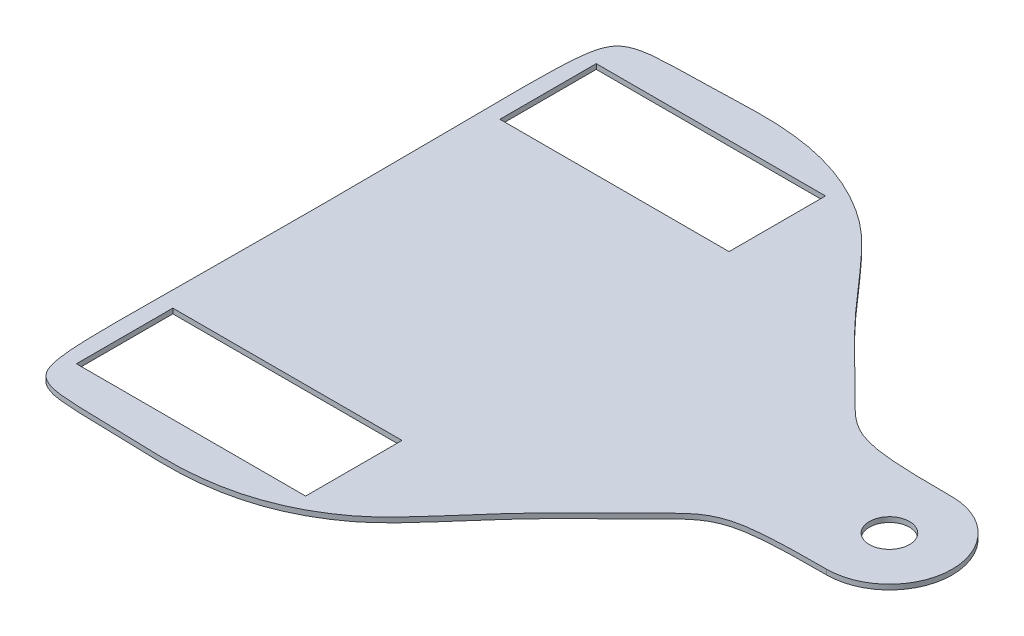
ISO-10303-21;
HEADER;
FILE_DESCRIPTION(('STEP AP214'),'2;1');
FILE_NAME('part.step','',(''),(''),'','','');
FILE_SCHEMA(('AUTOMOTIVE_DESIGN { 1 0 10303 214 1 1 1 1 }'));
ENDSEC;
DATA;
#1=APPLICATION_CONTEXT('core data for automotive mechanical design processes');
#2=APPLICATION_PROTOCOL_DEFINITION('international standard','automotive_design',2000,#1);
#3=PRODUCT_CONTEXT('',#1,'mechanical');
#4=PRODUCT('Part','Part','',(#3));
#5=PRODUCT_RELATED_PRODUCT_CATEGORY('part','',(#4));
#6=PRODUCT_DEFINITION_FORMATION('','',#4);
#7=PRODUCT_DEFINITION_CONTEXT('part definition',#1,'design');
#8=PRODUCT_DEFINITION('design','',#6,#7);
#9=PRODUCT_DEFINITION_SHAPE('','',#8);
#10=(LENGTH_UNIT() NAMED_UNIT(*) SI_UNIT(.MILLI.,.METRE.));
#11=(NAMED_UNIT(*) PLANE_ANGLE_UNIT() SI_UNIT($,.RADIAN.));
#12=(NAMED_UNIT(*) SI_UNIT($,.STERADIAN.) SOLID_ANGLE_UNIT());
#13=UNCERTAINTY_MEASURE_WITH_UNIT(LENGTH_MEASURE(1.E-05),#10,'distance_accuracy_value','');
#14=(GEOMETRIC_REPRESENTATION_CONTEXT(3) GLOBAL_UNCERTAINTY_ASSIGNED_CONTEXT((#13)) GLOBAL_UNIT_ASSIGNED_CONTEXT((#10,
#11,#12)) REPRESENTATION_CONTEXT('',''));
#15=CARTESIAN_POINT('',(0.,0.,0.));
#16=DIRECTION('',(0.,0.,1.));
#17=DIRECTION('',(1.,0.,0.));
#18=AXIS2_PLACEMENT_3D('',#15,#16,#17);
#19=CARTESIAN_POINT('',(0.,-1.2,15.));
#20=CARTESIAN_POINT('',(-26.0596661142578,-1.2,15.));
#21=CARTESIAN_POINT('',(-24.2984195046389,-1.2,16.8762062496136));
#22=CARTESIAN_POINT('',(-51.0085621302857,-1.2,41.9815243102457));
#23=CARTESIAN_POINT('',(-61.2895667684253,-1.2,55.9447354104585));
#24=CARTESIAN_POINT('',(-79.9531211554652,-1.2,69.6920830360387));
#25=CARTESIAN_POINT('',(-95.0157621605081,-1.2,71.7162556085096));
#26=CARTESIAN_POINT('',(-110.818983437193,-1.2,71.0052312531872));
#27=CARTESIAN_POINT('',(-126.521993889703,-1.2,70.8741001774513));
#28=CARTESIAN_POINT('',(-138.142838542993,-1.2,68.217935498934));
#29=CARTESIAN_POINT('',(-135.85,-1.2,61.1511041592246));
#30=CARTESIAN_POINT('',(-135.85,-1.2,0.));
#31=B_SPLINE_CURVE_WITH_KNOTS('',3,(#19,#20,#21,#22,#23,#24,#25,#26,#27,#28,#29,#30),
.UNSPECIFIED.,.F.,.F.,(4,1,1,1,1,1,1,1,1,4),(0.,0.141137684512468,0.170317060843302,
0.278296351923339,0.317035273345273,0.518967353640707,0.554462650934979,0.636492948993727,
0.682072062625964,1.),.UNSPECIFIED.);
#32=DIRECTION('',(0.,1.,0.));
#33=VECTOR('',#32,1.);
#34=SURFACE_OF_LINEAR_EXTRUSION('',#31,#33);
#35=CARTESIAN_POINT('',(0.,0.,15.));
#36=CARTESIAN_POINT('',(-26.0596661142578,0.,15.));
#37=CARTESIAN_POINT('',(-24.2984195046389,0.,16.8762062496136));
#38=CARTESIAN_POINT('',(-51.0085621302857,0.,41.9815243102457));
#39=CARTESIAN_POINT('',(-61.2895667684253,0.,55.9447354104585));
#40=CARTESIAN_POINT('',(-79.9531211554652,0.,69.6920830360387));
#41=CARTESIAN_POINT('',(-95.0157621605081,0.,71.7162556085096));
#42=CARTESIAN_POINT('',(-110.818983437193,0.,71.0052312531872));
#43=CARTESIAN_POINT('',(-126.521993889703,0.,70.8741001774513));
#44=CARTESIAN_POINT('',(-138.142838542993,0.,68.217935498934));
#45=CARTESIAN_POINT('',(-135.85,0.,61.1511041592246));
#46=CARTESIAN_POINT('',(-135.85,0.,0.));
#47=B_SPLINE_CURVE_WITH_KNOTS('',3,(#35,#36,#37,#38,#39,#40,#41,#42,#43,#44,#45,#46),
.UNSPECIFIED.,.F.,.F.,(4,1,1,1,1,1,1,1,1,4),(0.,0.141137684512468,0.170317060843302,
0.278296351923339,0.317035273345273,0.518967353640707,0.554462650934979,0.636492948993727,
0.682072062625964,1.),.UNSPECIFIED.);
#48=CARTESIAN_POINT('',(0.,0.,15.));
#49=VERTEX_POINT('',#48);
#50=CARTESIAN_POINT('',(-135.85,0.,0.));
#51=VERTEX_POINT('',#50);
#52=EDGE_CURVE('E165',#49,#51,#47,.T.);
#53=ORIENTED_EDGE('',*,*,#52,.T.);
#54=DIRECTION('',(0.,1.,0.));
#55=VECTOR('',#54,1.);
#56=CARTESIAN_POINT('',(-135.85,-1.2,0.));
#57=LINE('',#56,#55);
#58=CARTESIAN_POINT('',(-135.85,-1.2,0.));
#59=VERTEX_POINT('',#58);
#60=EDGE_CURVE('E11',#59,#51,#57,.T.);
#61=ORIENTED_EDGE('',*,*,#60,.F.);
#62=CARTESIAN_POINT('',(0.,-1.2,15.));
#63=VERTEX_POINT('',#62);
#64=EDGE_CURVE('E199',#63,#59,#31,.T.);
#65=ORIENTED_EDGE('',*,*,#64,.F.);
#66=DIRECTION('',(0.,1.,0.));
#67=VECTOR('',#66,1.);
#68=CARTESIAN_POINT('',(0.,-1.2,15.));
#69=LINE('',#68,#67);
#70=EDGE_CURVE('E46',#63,#49,#69,.T.);
#71=ORIENTED_EDGE('',*,*,#70,.T.);
#72=EDGE_LOOP('',(#53,#61,#65,#71));
#73=FACE_BOUND('',#72,.T.);
#74=ADVANCED_FACE('F42',(#73),#34,.F.);
#75=CARTESIAN_POINT('',(0.,-1.2,-15.));
#76=CARTESIAN_POINT('',(-26.0596661142578,-1.2,-15.));
#77=CARTESIAN_POINT('',(-24.2984195046389,-1.2,-16.8762062496136));
#78=CARTESIAN_POINT('',(-51.0085621302857,-1.2,-41.9815243102457));
#79=CARTESIAN_POINT('',(-61.2895667684253,-1.2,-55.9447354104585));
#80=CARTESIAN_POINT('',(-79.9531211554652,-1.2,-69.6920830360387));
#81=CARTESIAN_POINT('',(-95.0157621605081,-1.2,-71.7162556085096));
#82=CARTESIAN_POINT('',(-110.818983437193,-1.2,-71.0052312531872));
#83=CARTESIAN_POINT('',(-126.521993889703,-1.2,-70.8741001774513));
#84=CARTESIAN_POINT('',(-138.142838542993,-1.2,-68.217935498934));
#85=CARTESIAN_POINT('',(-135.85,-1.2,-61.1511041592246));
#86=CARTESIAN_POINT('',(-135.85,-1.2,0.));
#87=B_SPLINE_CURVE_WITH_KNOTS('',3,(#75,#76,#77,#78,#79,#80,#81,#82,#83,#84,#85,#86),
.UNSPECIFIED.,.F.,.F.,(4,1,1,1,1,1,1,1,1,4),(0.,0.141137684512468,0.170317060843302,
0.278296351923339,0.317035273345273,0.518967353640707,0.554462650934979,0.636492948993727,
0.682072062625964,1.),.UNSPECIFIED.);
#88=DIRECTION('',(0.,1.,0.));
#89=VECTOR('',#88,1.);
#90=SURFACE_OF_LINEAR_EXTRUSION('',#87,#89);
#91=CARTESIAN_POINT('',(0.,0.,-15.));
#92=CARTESIAN_POINT('',(-26.0596661142578,0.,-15.));
#93=CARTESIAN_POINT('',(-24.2984195046389,0.,-16.8762062496136));
#94=CARTESIAN_POINT('',(-51.0085621302857,0.,-41.9815243102457));
#95=CARTESIAN_POINT('',(-61.2895667684253,0.,-55.9447354104585));
#96=CARTESIAN_POINT('',(-79.9531211554652,0.,-69.6920830360387));
#97=CARTESIAN_POINT('',(-95.0157621605081,0.,-71.7162556085096));
#98=CARTESIAN_POINT('',(-110.818983437193,0.,-71.0052312531872));
#99=CARTESIAN_POINT('',(-126.521993889703,0.,-70.8741001774513));
#100=CARTESIAN_POINT('',(-138.142838542993,0.,-68.217935498934));
#101=CARTESIAN_POINT('',(-135.85,0.,-61.1511041592246));
#102=CARTESIAN_POINT('',(-135.85,0.,0.));
#103=B_SPLINE_CURVE_WITH_KNOTS('',3,(#91,#92,#93,#94,#95,#96,#97,#98,#99,#100,#101,#102),
.UNSPECIFIED.,.F.,.F.,(4,1,1,1,1,1,1,1,1,4),(0.,0.141137684512468,0.170317060843302,
0.278296351923339,0.317035273345273,0.518967353640707,0.554462650934979,0.636492948993727,
0.682072062625964,1.),.UNSPECIFIED.);
#104=CARTESIAN_POINT('',(0.,0.,-15.));
#105=VERTEX_POINT('',#104);
#106=EDGE_CURVE('E205',#105,#51,#103,.T.);
#107=ORIENTED_EDGE('',*,*,#106,.F.);
#108=DIRECTION('',(0.,1.,0.));
#109=VECTOR('',#108,1.);
#110=CARTESIAN_POINT('',(0.,-1.2,-15.));
#111=LINE('',#110,#109);
#112=CARTESIAN_POINT('',(0.,-1.2,-15.));
#113=VERTEX_POINT('',#112);
#114=EDGE_CURVE('E51',#113,#105,#111,.T.);
#115=ORIENTED_EDGE('',*,*,#114,.F.);
#116=EDGE_CURVE('E211',#113,#59,#87,.T.);
#117=ORIENTED_EDGE('',*,*,#116,.T.);
#118=ORIENTED_EDGE('',*,*,#60,.T.);
#119=EDGE_LOOP('',(#107,#115,#117,#118));
#120=FACE_BOUND('',#119,.T.);
#121=ADVANCED_FACE('F224',(#120),#90,.T.);
#122=CARTESIAN_POINT('',(0.,-1.2,0.));
#123=DIRECTION('',(0.,1.,0.));
#124=DIRECTION('',(0.,0.,1.));
#125=AXIS2_PLACEMENT_3D('',#122,#123,#124);
#126=CYLINDRICAL_SURFACE('',#125,15.);
#127=CARTESIAN_POINT('',(0.,0.,0.));
#128=DIRECTION('',(0.,1.,0.));
#129=DIRECTION('',(0.,0.,1.));
#130=AXIS2_PLACEMENT_3D('',#127,#128,#129);
#131=CIRCLE('',#130,15.);
#132=EDGE_CURVE('E249',#49,#105,#131,.T.);
#133=ORIENTED_EDGE('',*,*,#132,.F.);
#134=ORIENTED_EDGE('',*,*,#70,.F.);
#135=CARTESIAN_POINT('',(0.,-1.2,0.));
#136=DIRECTION('',(0.,1.,0.));
#137=DIRECTION('',(0.,0.,1.));
#138=AXIS2_PLACEMENT_3D('',#135,#136,#137);
#139=CIRCLE('',#138,15.);
#140=EDGE_CURVE('E204',#63,#113,#139,.T.);
#141=ORIENTED_EDGE('',*,*,#140,.T.);
#142=ORIENTED_EDGE('',*,*,#114,.T.);
#143=EDGE_LOOP('',(#133,#134,#141,#142));
#144=FACE_BOUND('',#143,.T.);
#145=ADVANCED_FACE('F227',(#144),#126,.T.);
#146=CARTESIAN_POINT('',(0.,-1.2,0.));
#147=DIRECTION('',(0.,1.,0.));
#148=DIRECTION('',(0.,0.,1.));
#149=AXIS2_PLACEMENT_3D('',#146,#147,#148);
#150=PLANE('',#149);
#151=CARTESIAN_POINT('',(0.,-1.2,0.));
#152=DIRECTION('',(0.,1.,0.));
#153=DIRECTION('',(0.,0.,1.));
#154=AXIS2_PLACEMENT_3D('',#151,#152,#153);
#155=CIRCLE('',#154,4.7879);
#156=CARTESIAN_POINT('',(0.,-1.2,4.7879));
#157=VERTEX_POINT('',#156);
#158=EDGE_CURVE('E178',#157,#157,#155,.T.);
#159=ORIENTED_EDGE('',*,*,#158,.T.);
#160=EDGE_LOOP('',(#159));
#161=FACE_BOUND('',#160,.T.);
#162=DIRECTION('',(-1.,0.,0.));
#163=VECTOR('',#162,1.);
#164=CARTESIAN_POINT('',(-77.4500000000001,-1.2,-39.1));
#165=LINE('',#164,#163);
#166=CARTESIAN_POINT('',(-77.4500000000001,-1.2,-39.1));
#167=VERTEX_POINT('',#166);
#168=CARTESIAN_POINT('',(-132.25,-1.2,-39.1));
#169=VERTEX_POINT('',#168);
#170=EDGE_CURVE('E159',#167,#169,#165,.T.);
#171=ORIENTED_EDGE('',*,*,#170,.F.);
#172=DIRECTION('',(0.,0.,1.));
#173=VECTOR('',#172,1.);
#174=CARTESIAN_POINT('',(-77.4500000000001,-1.2,-62.15));
#175=LINE('',#174,#173);
#176=CARTESIAN_POINT('',(-77.4500000000001,-1.2,-62.15));
#177=VERTEX_POINT('',#176);
#178=EDGE_CURVE('E59',#177,#167,#175,.T.);
#179=ORIENTED_EDGE('',*,*,#178,.F.);
#180=DIRECTION('',(1.,0.,0.));
#181=VECTOR('',#180,1.);
#182=CARTESIAN_POINT('',(-132.25,-1.2,-62.15));
#183=LINE('',#182,#181);
#184=CARTESIAN_POINT('',(-132.25,-1.2,-62.15));
#185=VERTEX_POINT('',#184);
#186=EDGE_CURVE('E147',#185,#177,#183,.T.);
#187=ORIENTED_EDGE('',*,*,#186,.F.);
#188=DIRECTION('',(0.,0.,-1.));
#189=VECTOR('',#188,1.);
#190=CARTESIAN_POINT('',(-132.25,-1.2,-39.1));
#191=LINE('',#190,#189);
#192=EDGE_CURVE('E150',#169,#185,#191,.T.);
#193=ORIENTED_EDGE('',*,*,#192,.F.);
#194=EDGE_LOOP('',(#171,#179,#187,#193));
#195=FACE_BOUND('',#194,.T.);
#196=DIRECTION('',(0.,0.,1.));
#197=VECTOR('',#196,1.);
#198=CARTESIAN_POINT('',(-77.4500000000001,-1.2,39.1));
#199=LINE('',#198,#197);
#200=CARTESIAN_POINT('',(-77.4500000000001,-1.2,39.1));
#201=VERTEX_POINT('',#200);
#202=CARTESIAN_POINT('',(-77.4500000000001,-1.2,62.15));
#203=VERTEX_POINT('',#202);
#204=EDGE_CURVE('E186',#201,#203,#199,.T.);
#205=ORIENTED_EDGE('',*,*,#204,.F.);
#206=DIRECTION('',(1.,0.,0.));
#207=VECTOR('',#206,1.);
#208=CARTESIAN_POINT('',(-132.25,-1.2,39.1));
#209=LINE('',#208,#207);
#210=CARTESIAN_POINT('',(-132.25,-1.2,39.1));
#211=VERTEX_POINT('',#210);
#212=EDGE_CURVE('E67',#211,#201,#209,.T.);
#213=ORIENTED_EDGE('',*,*,#212,.F.);
#214=DIRECTION('',(0.,0.,-1.));
#215=VECTOR('',#214,1.);
#216=CARTESIAN_POINT('',(-132.25,-1.2,62.15));
#217=LINE('',#216,#215);
#218=CARTESIAN_POINT('',(-132.25,-1.2,62.15));
#219=VERTEX_POINT('',#218);
#220=EDGE_CURVE('E179',#219,#211,#217,.T.);
#221=ORIENTED_EDGE('',*,*,#220,.F.);
#222=DIRECTION('',(-1.,0.,0.));
#223=VECTOR('',#222,1.);
#224=CARTESIAN_POINT('',(-77.4500000000001,-1.2,62.15));
#225=LINE('',#224,#223);
#226=EDGE_CURVE('E182',#203,#219,#225,.T.);
#227=ORIENTED_EDGE('',*,*,#226,.F.);
#228=EDGE_LOOP('',(#205,#213,#221,#227));
#229=FACE_BOUND('',#228,.T.);
#230=ORIENTED_EDGE('',*,*,#64,.T.);
#231=ORIENTED_EDGE('',*,*,#116,.F.);
#232=ORIENTED_EDGE('',*,*,#140,.F.);
#233=EDGE_LOOP('',(#230,#231,#232));
#234=FACE_BOUND('',#233,.T.);
#235=ADVANCED_FACE('F231',(#161,#195,#229,#234),#150,.F.);
#236=CARTESIAN_POINT('',(0.,0.,0.));
#237=DIRECTION('',(0.,1.,0.));
#238=DIRECTION('',(0.,0.,1.));
#239=AXIS2_PLACEMENT_3D('',#236,#237,#238);
#240=PLANE('',#239);
#241=CARTESIAN_POINT('',(0.,0.,0.));
#242=DIRECTION('',(0.,1.,0.));
#243=DIRECTION('',(0.,0.,1.));
#244=AXIS2_PLACEMENT_3D('',#241,#242,#243);
#245=CIRCLE('',#244,4.7879);
#246=CARTESIAN_POINT('',(0.,0.,4.7879));
#247=VERTEX_POINT('',#246);
#248=EDGE_CURVE('E153',#247,#247,#245,.T.);
#249=ORIENTED_EDGE('',*,*,#248,.F.);
#250=EDGE_LOOP('',(#249));
#251=FACE_BOUND('',#250,.T.);
#252=DIRECTION('',(0.,0.,1.));
#253=VECTOR('',#252,1.);
#254=CARTESIAN_POINT('',(-77.4500000000001,0.,-62.15));
#255=LINE('',#254,#253);
#256=CARTESIAN_POINT('',(-77.4500000000001,0.,-62.15));
#257=VERTEX_POINT('',#256);
#258=CARTESIAN_POINT('',(-77.4500000000001,0.,-39.1));
#259=VERTEX_POINT('',#258);
#260=EDGE_CURVE('E128',#257,#259,#255,.T.);
#261=ORIENTED_EDGE('',*,*,#260,.T.);
#262=DIRECTION('',(-1.,0.,0.));
#263=VECTOR('',#262,1.);
#264=CARTESIAN_POINT('',(-77.4500000000001,0.,-39.1));
#265=LINE('',#264,#263);
#266=CARTESIAN_POINT('',(-132.25,0.,-39.1));
#267=VERTEX_POINT('',#266);
#268=EDGE_CURVE('E138',#259,#267,#265,.T.);
#269=ORIENTED_EDGE('',*,*,#268,.T.);
#270=DIRECTION('',(0.,0.,-1.));
#271=VECTOR('',#270,1.);
#272=CARTESIAN_POINT('',(-132.25,0.,-39.1));
#273=LINE('',#272,#271);
#274=CARTESIAN_POINT('',(-132.25,0.,-62.15));
#275=VERTEX_POINT('',#274);
#276=EDGE_CURVE('E142',#267,#275,#273,.T.);
#277=ORIENTED_EDGE('',*,*,#276,.T.);
#278=DIRECTION('',(1.,0.,0.));
#279=VECTOR('',#278,1.);
#280=CARTESIAN_POINT('',(-132.25,0.,-62.15));
#281=LINE('',#280,#279);
#282=EDGE_CURVE('E134',#275,#257,#281,.T.);
#283=ORIENTED_EDGE('',*,*,#282,.T.);
#284=EDGE_LOOP('',(#261,#269,#277,#283));
#285=FACE_BOUND('',#284,.T.);
#286=DIRECTION('',(1.,0.,0.));
#287=VECTOR('',#286,1.);
#288=CARTESIAN_POINT('',(-132.25,0.,39.1));
#289=LINE('',#288,#287);
#290=CARTESIAN_POINT('',(-132.25,0.,39.1));
#291=VERTEX_POINT('',#290);
#292=CARTESIAN_POINT('',(-77.4500000000001,0.,39.1));
#293=VERTEX_POINT('',#292);
#294=EDGE_CURVE('E183',#291,#293,#289,.T.);
#295=ORIENTED_EDGE('',*,*,#294,.T.);
#296=DIRECTION('',(0.,0.,1.));
#297=VECTOR('',#296,1.);
#298=CARTESIAN_POINT('',(-77.4500000000001,0.,39.1));
#299=LINE('',#298,#297);
#300=CARTESIAN_POINT('',(-77.4500000000001,0.,62.15));
#301=VERTEX_POINT('',#300);
#302=EDGE_CURVE('E195',#293,#301,#299,.T.);
#303=ORIENTED_EDGE('',*,*,#302,.T.);
#304=DIRECTION('',(-1.,0.,0.));
#305=VECTOR('',#304,1.);
#306=CARTESIAN_POINT('',(-77.4500000000001,0.,62.15));
#307=LINE('',#306,#305);
#308=CARTESIAN_POINT('',(-132.25,0.,62.15));
#309=VERTEX_POINT('',#308);
#310=EDGE_CURVE('E192',#301,#309,#307,.T.);
#311=ORIENTED_EDGE('',*,*,#310,.T.);
#312=DIRECTION('',(0.,0.,-1.));
#313=VECTOR('',#312,1.);
#314=CARTESIAN_POINT('',(-132.25,0.,62.15));
#315=LINE('',#314,#313);
#316=EDGE_CURVE('E171',#309,#291,#315,.T.);
#317=ORIENTED_EDGE('',*,*,#316,.T.);
#318=EDGE_LOOP('',(#295,#303,#311,#317));
#319=FACE_BOUND('',#318,.T.);
#320=ORIENTED_EDGE('',*,*,#52,.F.);
#321=ORIENTED_EDGE('',*,*,#132,.T.);
#322=ORIENTED_EDGE('',*,*,#106,.T.);
#323=EDGE_LOOP('',(#320,#321,#322));
#324=FACE_BOUND('',#323,.T.);
#325=ADVANCED_FACE('F144',(#251,#285,#319,#324),#240,.T.);
#326=CARTESIAN_POINT('',(-132.25,0.,39.1));
#327=DIRECTION('',(0.,0.,-1.));
#328=DIRECTION('',(-1.,0.,0.));
#329=AXIS2_PLACEMENT_3D('',#326,#327,#328);
#330=PLANE('',#329);
#331=ORIENTED_EDGE('',*,*,#212,.T.);
#332=DIRECTION('',(0.,-1.,0.));
#333=VECTOR('',#332,1.);
#334=CARTESIAN_POINT('',(-77.4500000000001,0.,39.1));
#335=LINE('',#334,#333);
#336=EDGE_CURVE('E169',#293,#201,#335,.T.);
#337=ORIENTED_EDGE('',*,*,#336,.F.);
#338=ORIENTED_EDGE('',*,*,#294,.F.);
#339=DIRECTION('',(0.,-1.,0.));
#340=VECTOR('',#339,1.);
#341=CARTESIAN_POINT('',(-132.25,0.,39.1));
#342=LINE('',#341,#340);
#343=EDGE_CURVE('E176',#291,#211,#342,.T.);
#344=ORIENTED_EDGE('',*,*,#343,.T.);
#345=EDGE_LOOP('',(#331,#337,#338,#344));
#346=FACE_BOUND('',#345,.T.);
#347=ADVANCED_FACE('F261',(#346),#330,.F.);
#348=CARTESIAN_POINT('',(-132.25,0.,62.15));
#349=DIRECTION('',(-1.,0.,0.));
#350=DIRECTION('',(0.,0.,1.));
#351=AXIS2_PLACEMENT_3D('',#348,#349,#350);
#352=PLANE('',#351);
#353=ORIENTED_EDGE('',*,*,#220,.T.);
#354=ORIENTED_EDGE('',*,*,#343,.F.);
#355=ORIENTED_EDGE('',*,*,#316,.F.);
#356=DIRECTION('',(0.,-1.,0.));
#357=VECTOR('',#356,1.);
#358=CARTESIAN_POINT('',(-132.25,0.,62.15));
#359=LINE('',#358,#357);
#360=EDGE_CURVE('E174',#309,#219,#359,.T.);
#361=ORIENTED_EDGE('',*,*,#360,.T.);
#362=EDGE_LOOP('',(#353,#354,#355,#361));
#363=FACE_BOUND('',#362,.T.);
#364=ADVANCED_FACE('F266',(#363),#352,.F.);
#365=CARTESIAN_POINT('',(-77.4500000000001,0.,62.15));
#366=DIRECTION('',(0.,0.,1.));
#367=DIRECTION('',(1.,0.,0.));
#368=AXIS2_PLACEMENT_3D('',#365,#366,#367);
#369=PLANE('',#368);
#370=ORIENTED_EDGE('',*,*,#226,.T.);
#371=ORIENTED_EDGE('',*,*,#360,.F.);
#372=ORIENTED_EDGE('',*,*,#310,.F.);
#373=DIRECTION('',(0.,-1.,0.));
#374=VECTOR('',#373,1.);
#375=CARTESIAN_POINT('',(-77.4500000000001,0.,62.15));
#376=LINE('',#375,#374);
#377=EDGE_CURVE('E172',#301,#203,#376,.T.);
#378=ORIENTED_EDGE('',*,*,#377,.T.);
#379=EDGE_LOOP('',(#370,#371,#372,#378));
#380=FACE_BOUND('',#379,.T.);
#381=ADVANCED_FACE('F296',(#380),#369,.F.);
#382=CARTESIAN_POINT('',(-77.4500000000001,0.,39.1));
#383=DIRECTION('',(1.,0.,0.));
#384=DIRECTION('',(0.,0.,-1.));
#385=AXIS2_PLACEMENT_3D('',#382,#383,#384);
#386=PLANE('',#385);
#387=ORIENTED_EDGE('',*,*,#204,.T.);
#388=ORIENTED_EDGE('',*,*,#377,.F.);
#389=ORIENTED_EDGE('',*,*,#302,.F.);
#390=ORIENTED_EDGE('',*,*,#336,.T.);
#391=EDGE_LOOP('',(#387,#388,#389,#390));
#392=FACE_BOUND('',#391,.T.);
#393=ADVANCED_FACE('F292',(#392),#386,.F.);
#394=CARTESIAN_POINT('',(-77.4500000000001,0.,-62.15));
#395=DIRECTION('',(1.,0.,0.));
#396=DIRECTION('',(0.,0.,-1.));
#397=AXIS2_PLACEMENT_3D('',#394,#395,#396);
#398=PLANE('',#397);
#399=ORIENTED_EDGE('',*,*,#178,.T.);
#400=DIRECTION('',(0.,-1.,0.));
#401=VECTOR('',#400,1.);
#402=CARTESIAN_POINT('',(-77.4500000000001,0.,-39.1));
#403=LINE('',#402,#401);
#404=EDGE_CURVE('E124',#259,#167,#403,.T.);
#405=ORIENTED_EDGE('',*,*,#404,.F.);
#406=ORIENTED_EDGE('',*,*,#260,.F.);
#407=DIRECTION('',(0.,-1.,0.));
#408=VECTOR('',#407,1.);
#409=CARTESIAN_POINT('',(-77.4500000000001,0.,-62.15));
#410=LINE('',#409,#408);
#411=EDGE_CURVE('E163',#257,#177,#410,.T.);
#412=ORIENTED_EDGE('',*,*,#411,.T.);
#413=EDGE_LOOP('',(#399,#405,#406,#412));
#414=FACE_BOUND('',#413,.T.);
#415=ADVANCED_FACE('F126',(#414),#398,.F.);
#416=CARTESIAN_POINT('',(-132.25,0.,-62.15));
#417=DIRECTION('',(0.,0.,-1.));
#418=DIRECTION('',(-1.,0.,0.));
#419=AXIS2_PLACEMENT_3D('',#416,#417,#418);
#420=PLANE('',#419);
#421=ORIENTED_EDGE('',*,*,#186,.T.);
#422=ORIENTED_EDGE('',*,*,#411,.F.);
#423=ORIENTED_EDGE('',*,*,#282,.F.);
#424=DIRECTION('',(0.,-1.,0.));
#425=VECTOR('',#424,1.);
#426=CARTESIAN_POINT('',(-132.25,0.,-62.15));
#427=LINE('',#426,#425);
#428=EDGE_CURVE('E166',#275,#185,#427,.T.);
#429=ORIENTED_EDGE('',*,*,#428,.T.);
#430=EDGE_LOOP('',(#421,#422,#423,#429));
#431=FACE_BOUND('',#430,.T.);
#432=ADVANCED_FACE('F284',(#431),#420,.F.);
#433=CARTESIAN_POINT('',(-132.25,0.,-39.1));
#434=DIRECTION('',(-1.,0.,0.));
#435=DIRECTION('',(0.,0.,1.));
#436=AXIS2_PLACEMENT_3D('',#433,#434,#435);
#437=PLANE('',#436);
#438=ORIENTED_EDGE('',*,*,#192,.T.);
#439=ORIENTED_EDGE('',*,*,#428,.F.);
#440=ORIENTED_EDGE('',*,*,#276,.F.);
#441=DIRECTION('',(0.,-1.,0.));
#442=VECTOR('',#441,1.);
#443=CARTESIAN_POINT('',(-132.25,0.,-39.1));
#444=LINE('',#443,#442);
#445=EDGE_CURVE('E133',#267,#169,#444,.T.);
#446=ORIENTED_EDGE('',*,*,#445,.T.);
#447=EDGE_LOOP('',(#438,#439,#440,#446));
#448=FACE_BOUND('',#447,.T.);
#449=ADVANCED_FACE('F281',(#448),#437,.F.);
#450=CARTESIAN_POINT('',(-77.4500000000001,0.,-39.1));
#451=DIRECTION('',(0.,0.,1.));
#452=DIRECTION('',(1.,0.,0.));
#453=AXIS2_PLACEMENT_3D('',#450,#451,#452);
#454=PLANE('',#453);
#455=ORIENTED_EDGE('',*,*,#170,.T.);
#456=ORIENTED_EDGE('',*,*,#445,.F.);
#457=ORIENTED_EDGE('',*,*,#268,.F.);
#458=ORIENTED_EDGE('',*,*,#404,.T.);
#459=EDGE_LOOP('',(#455,#456,#457,#458));
#460=FACE_BOUND('',#459,.T.);
#461=ADVANCED_FACE('F139',(#460),#454,.F.);
#462=CARTESIAN_POINT('',(0.,-1.2,0.));
#463=DIRECTION('',(0.,1.,0.));
#464=DIRECTION('',(0.,0.,1.));
#465=AXIS2_PLACEMENT_3D('',#462,#463,#464);
#466=CYLINDRICAL_SURFACE('',#465,4.7879);
#467=ORIENTED_EDGE('',*,*,#158,.F.);
#468=EDGE_LOOP('',(#467));
#469=FACE_BOUND('',#468,.T.);
#470=ORIENTED_EDGE('',*,*,#248,.T.);
#471=EDGE_LOOP('',(#470));
#472=FACE_BOUND('',#471,.T.);
#473=ADVANCED_FACE('F275',(#469,#472),#466,.F.);
#474=CLOSED_SHELL('',(#74,#121,#145,#235,#325,#347,#364,#381,#393,#415,#432,#449,#461,#473));
#475=MANIFOLD_SOLID_BREP('B2',#474);
#476=ADVANCED_BREP_SHAPE_REPRESENTATION('',(#18,#475),#14);
#477=SHAPE_DEFINITION_REPRESENTATION(#9,#476);
ENDSEC;
END-ISO-10303-21;
